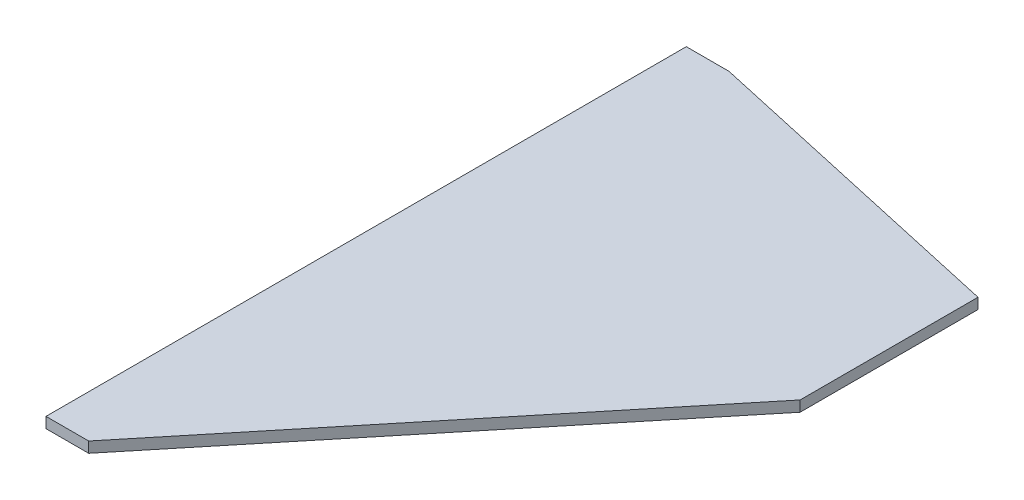
ISO-10303-21;
HEADER;
FILE_DESCRIPTION(('STEP AP214'),'2;1');
FILE_NAME('part.step','',(''),(''),'','','');
FILE_SCHEMA(('AUTOMOTIVE_DESIGN { 1 0 10303 214 1 1 1 1 }'));
ENDSEC;
DATA;
#1=APPLICATION_CONTEXT('core data for automotive mechanical design processes');
#2=APPLICATION_PROTOCOL_DEFINITION('international standard','automotive_design',2000,#1);
#3=PRODUCT_CONTEXT('',#1,'mechanical');
#4=PRODUCT('Part','Part','',(#3));
#5=PRODUCT_RELATED_PRODUCT_CATEGORY('part','',(#4));
#6=PRODUCT_DEFINITION_FORMATION('','',#4);
#7=PRODUCT_DEFINITION_CONTEXT('part definition',#1,'design');
#8=PRODUCT_DEFINITION('design','',#6,#7);
#9=PRODUCT_DEFINITION_SHAPE('','',#8);
#10=(LENGTH_UNIT() NAMED_UNIT(*) SI_UNIT(.MILLI.,.METRE.));
#11=(NAMED_UNIT(*) PLANE_ANGLE_UNIT() SI_UNIT($,.RADIAN.));
#12=(NAMED_UNIT(*) SI_UNIT($,.STERADIAN.) SOLID_ANGLE_UNIT());
#13=UNCERTAINTY_MEASURE_WITH_UNIT(LENGTH_MEASURE(1.E-05),#10,'distance_accuracy_value','');
#14=(GEOMETRIC_REPRESENTATION_CONTEXT(3) GLOBAL_UNCERTAINTY_ASSIGNED_CONTEXT((#13)) GLOBAL_UNIT_ASSIGNED_CONTEXT((#10,
#11,#12)) REPRESENTATION_CONTEXT('',''));
#15=CARTESIAN_POINT('',(0.,0.,0.));
#16=DIRECTION('',(0.,0.,1.));
#17=DIRECTION('',(1.,0.,0.));
#18=AXIS2_PLACEMENT_3D('',#15,#16,#17);
#19=CARTESIAN_POINT('',(0.,3.,0.));
#20=DIRECTION('',(1.,0.,0.));
#21=DIRECTION('',(0.,0.,-1.));
#22=AXIS2_PLACEMENT_3D('',#19,#20,#21);
#23=PLANE('',#22);
#24=DIRECTION('',(0.,0.,1.));
#25=VECTOR('',#24,1.);
#26=CARTESIAN_POINT('',(0.,0.,0.));
#27=LINE('',#26,#25);
#28=CARTESIAN_POINT('',(0.,0.,-180.));
#29=VERTEX_POINT('',#28);
#30=CARTESIAN_POINT('',(0.,0.,0.));
#31=VERTEX_POINT('',#30);
#32=EDGE_CURVE('E128',#29,#31,#27,.T.);
#33=ORIENTED_EDGE('',*,*,#32,.T.);
#34=DIRECTION('',(0.,-1.,0.));
#35=VECTOR('',#34,1.);
#36=CARTESIAN_POINT('',(0.,3.,0.));
#37=LINE('',#36,#35);
#38=CARTESIAN_POINT('',(0.,3.,0.));
#39=VERTEX_POINT('',#38);
#40=EDGE_CURVE('E11',#39,#31,#37,.T.);
#41=ORIENTED_EDGE('',*,*,#40,.F.);
#42=DIRECTION('',(0.,0.,1.));
#43=VECTOR('',#42,1.);
#44=CARTESIAN_POINT('',(0.,3.,0.));
#45=LINE('',#44,#43);
#46=CARTESIAN_POINT('',(0.,3.,-180.));
#47=VERTEX_POINT('',#46);
#48=EDGE_CURVE('E144',#47,#39,#45,.T.);
#49=ORIENTED_EDGE('',*,*,#48,.F.);
#50=DIRECTION('',(0.,-1.,0.));
#51=VECTOR('',#50,1.);
#52=CARTESIAN_POINT('',(0.,3.,-180.));
#53=LINE('',#52,#51);
#54=EDGE_CURVE('E124',#47,#29,#53,.T.);
#55=ORIENTED_EDGE('',*,*,#54,.T.);
#56=EDGE_LOOP('',(#33,#41,#49,#55));
#57=FACE_BOUND('',#56,.T.);
#58=ADVANCED_FACE('F39',(#57),#23,.F.);
#59=CARTESIAN_POINT('',(0.,3.,0.));
#60=DIRECTION('',(0.,0.,-1.));
#61=DIRECTION('',(-1.,0.,0.));
#62=AXIS2_PLACEMENT_3D('',#59,#60,#61);
#63=PLANE('',#62);
#64=DIRECTION('',(1.,0.,0.));
#65=VECTOR('',#64,1.);
#66=CARTESIAN_POINT('',(0.,0.,0.));
#67=LINE('',#66,#65);
#68=CARTESIAN_POINT('',(12.,0.,0.));
#69=VERTEX_POINT('',#68);
#70=EDGE_CURVE('E132',#31,#69,#67,.T.);
#71=ORIENTED_EDGE('',*,*,#70,.T.);
#72=DIRECTION('',(0.,-1.,0.));
#73=VECTOR('',#72,1.);
#74=CARTESIAN_POINT('',(12.,3.,0.));
#75=LINE('',#74,#73);
#76=CARTESIAN_POINT('',(12.,3.,0.));
#77=VERTEX_POINT('',#76);
#78=EDGE_CURVE('E48',#77,#69,#75,.T.);
#79=ORIENTED_EDGE('',*,*,#78,.F.);
#80=DIRECTION('',(1.,0.,0.));
#81=VECTOR('',#80,1.);
#82=CARTESIAN_POINT('',(0.,3.,0.));
#83=LINE('',#82,#81);
#84=EDGE_CURVE('E93',#39,#77,#83,.T.);
#85=ORIENTED_EDGE('',*,*,#84,.F.);
#86=ORIENTED_EDGE('',*,*,#40,.T.);
#87=EDGE_LOOP('',(#71,#79,#85,#86));
#88=FACE_BOUND('',#87,.T.);
#89=ADVANCED_FACE('F172',(#88),#63,.F.);
#90=CARTESIAN_POINT('',(12.,3.,0.));
#91=DIRECTION('',(-0.773957299203321,0.,-0.633237790257263));
#92=DIRECTION('',(-0.633237790257263,0.,0.773957299203321));
#93=AXIS2_PLACEMENT_3D('',#90,#91,#92);
#94=PLANE('',#93);
#95=DIRECTION('',(0.633237790257263,0.,-0.773957299203321));
#96=VECTOR('',#95,1.);
#97=CARTESIAN_POINT('',(12.,0.,0.));
#98=LINE('',#97,#96);
#99=CARTESIAN_POINT('',(102.,0.,-110.));
#100=VERTEX_POINT('',#99);
#101=EDGE_CURVE('E135',#69,#100,#98,.T.);
#102=ORIENTED_EDGE('',*,*,#101,.T.);
#103=DIRECTION('',(0.,-1.,0.));
#104=VECTOR('',#103,1.);
#105=CARTESIAN_POINT('',(102.,3.,-110.));
#106=LINE('',#105,#104);
#107=CARTESIAN_POINT('',(102.,3.,-110.));
#108=VERTEX_POINT('',#107);
#109=EDGE_CURVE('E117',#108,#100,#106,.T.);
#110=ORIENTED_EDGE('',*,*,#109,.F.);
#111=DIRECTION('',(0.633237790257263,0.,-0.773957299203321));
#112=VECTOR('',#111,1.);
#113=CARTESIAN_POINT('',(12.,3.,0.));
#114=LINE('',#113,#112);
#115=EDGE_CURVE('E106',#77,#108,#114,.T.);
#116=ORIENTED_EDGE('',*,*,#115,.F.);
#117=ORIENTED_EDGE('',*,*,#78,.T.);
#118=EDGE_LOOP('',(#102,#110,#116,#117));
#119=FACE_BOUND('',#118,.T.);
#120=ADVANCED_FACE('F154',(#119),#94,.F.);
#121=CARTESIAN_POINT('',(102.,3.,-110.));
#122=DIRECTION('',(-1.,0.,0.));
#123=DIRECTION('',(0.,0.,1.));
#124=AXIS2_PLACEMENT_3D('',#121,#122,#123);
#125=PLANE('',#124);
#126=DIRECTION('',(0.,0.,-1.));
#127=VECTOR('',#126,1.);
#128=CARTESIAN_POINT('',(102.,0.,-110.));
#129=LINE('',#128,#127);
#130=CARTESIAN_POINT('',(102.,0.,-160.));
#131=VERTEX_POINT('',#130);
#132=EDGE_CURVE('E115',#100,#131,#129,.T.);
#133=ORIENTED_EDGE('',*,*,#132,.T.);
#134=DIRECTION('',(0.,-1.,0.));
#135=VECTOR('',#134,1.);
#136=CARTESIAN_POINT('',(102.,3.,-160.));
#137=LINE('',#136,#135);
#138=CARTESIAN_POINT('',(102.,3.,-160.));
#139=VERTEX_POINT('',#138);
#140=EDGE_CURVE('E112',#139,#131,#137,.T.);
#141=ORIENTED_EDGE('',*,*,#140,.F.);
#142=DIRECTION('',(0.,0.,-1.));
#143=VECTOR('',#142,1.);
#144=CARTESIAN_POINT('',(102.,3.,-110.));
#145=LINE('',#144,#143);
#146=EDGE_CURVE('E100',#108,#139,#145,.T.);
#147=ORIENTED_EDGE('',*,*,#146,.F.);
#148=ORIENTED_EDGE('',*,*,#109,.T.);
#149=EDGE_LOOP('',(#133,#141,#147,#148));
#150=FACE_BOUND('',#149,.T.);
#151=ADVANCED_FACE('F113',(#150),#125,.F.);
#152=CARTESIAN_POINT('',(102.,3.,-160.));
#153=DIRECTION('',(-0.216930457818656,0.,0.976187060183953));
#154=DIRECTION('',(0.976187060183953,0.,0.216930457818656));
#155=AXIS2_PLACEMENT_3D('',#152,#153,#154);
#156=PLANE('',#155);
#157=DIRECTION('',(-0.976187060183953,0.,-0.216930457818656));
#158=VECTOR('',#157,1.);
#159=CARTESIAN_POINT('',(102.,0.,-160.));
#160=LINE('',#159,#158);
#161=CARTESIAN_POINT('',(12.,0.,-180.));
#162=VERTEX_POINT('',#161);
#163=EDGE_CURVE('E79',#131,#162,#160,.T.);
#164=ORIENTED_EDGE('',*,*,#163,.T.);
#165=DIRECTION('',(0.,-1.,0.));
#166=VECTOR('',#165,1.);
#167=CARTESIAN_POINT('',(12.,3.,-180.));
#168=LINE('',#167,#166);
#169=CARTESIAN_POINT('',(12.,3.,-180.));
#170=VERTEX_POINT('',#169);
#171=EDGE_CURVE('E118',#170,#162,#168,.T.);
#172=ORIENTED_EDGE('',*,*,#171,.F.);
#173=DIRECTION('',(-0.976187060183953,0.,-0.216930457818656));
#174=VECTOR('',#173,1.);
#175=CARTESIAN_POINT('',(102.,3.,-160.));
#176=LINE('',#175,#174);
#177=EDGE_CURVE('E104',#139,#170,#176,.T.);
#178=ORIENTED_EDGE('',*,*,#177,.F.);
#179=ORIENTED_EDGE('',*,*,#140,.T.);
#180=EDGE_LOOP('',(#164,#172,#178,#179));
#181=FACE_BOUND('',#180,.T.);
#182=ADVANCED_FACE('F120',(#181),#156,.F.);
#183=CARTESIAN_POINT('',(0.,3.,-180.));
#184=DIRECTION('',(0.,0.,1.));
#185=DIRECTION('',(1.,0.,0.));
#186=AXIS2_PLACEMENT_3D('',#183,#184,#185);
#187=PLANE('',#186);
#188=DIRECTION('',(-1.,0.,0.));
#189=VECTOR('',#188,1.);
#190=CARTESIAN_POINT('',(0.,0.,-180.));
#191=LINE('',#190,#189);
#192=EDGE_CURVE('E85',#162,#29,#191,.T.);
#193=ORIENTED_EDGE('',*,*,#192,.T.);
#194=ORIENTED_EDGE('',*,*,#54,.F.);
#195=DIRECTION('',(-1.,0.,0.));
#196=VECTOR('',#195,1.);
#197=CARTESIAN_POINT('',(0.,3.,-180.));
#198=LINE('',#197,#196);
#199=EDGE_CURVE('E56',#170,#47,#198,.T.);
#200=ORIENTED_EDGE('',*,*,#199,.F.);
#201=ORIENTED_EDGE('',*,*,#171,.T.);
#202=EDGE_LOOP('',(#193,#194,#200,#201));
#203=FACE_BOUND('',#202,.T.);
#204=ADVANCED_FACE('F161',(#203),#187,.F.);
#205=CARTESIAN_POINT('',(0.,3.,0.));
#206=DIRECTION('',(0.,-1.,0.));
#207=DIRECTION('',(0.,0.,-1.));
#208=AXIS2_PLACEMENT_3D('',#205,#206,#207);
#209=PLANE('',#208);
#210=ORIENTED_EDGE('',*,*,#48,.T.);
#211=ORIENTED_EDGE('',*,*,#84,.T.);
#212=ORIENTED_EDGE('',*,*,#115,.T.);
#213=ORIENTED_EDGE('',*,*,#146,.T.);
#214=ORIENTED_EDGE('',*,*,#177,.T.);
#215=ORIENTED_EDGE('',*,*,#199,.T.);
#216=EDGE_LOOP('',(#210,#211,#212,#213,#214,#215));
#217=FACE_BOUND('',#216,.T.);
#218=ADVANCED_FACE('F102',(#217),#209,.F.);
#219=CARTESIAN_POINT('',(0.,0.,0.));
#220=DIRECTION('',(0.,-1.,0.));
#221=DIRECTION('',(0.,0.,-1.));
#222=AXIS2_PLACEMENT_3D('',#219,#220,#221);
#223=PLANE('',#222);
#224=ORIENTED_EDGE('',*,*,#32,.F.);
#225=ORIENTED_EDGE('',*,*,#192,.F.);
#226=ORIENTED_EDGE('',*,*,#163,.F.);
#227=ORIENTED_EDGE('',*,*,#132,.F.);
#228=ORIENTED_EDGE('',*,*,#101,.F.);
#229=ORIENTED_EDGE('',*,*,#70,.F.);
#230=EDGE_LOOP('',(#224,#225,#226,#227,#228,#229));
#231=FACE_BOUND('',#230,.T.);
#232=ADVANCED_FACE('F157',(#231),#223,.T.);
#233=CLOSED_SHELL('',(#58,#89,#120,#151,#182,#204,#218,#232));
#234=MANIFOLD_SOLID_BREP('B2',#233);
#235=ADVANCED_BREP_SHAPE_REPRESENTATION('',(#18,#234),#14);
#236=SHAPE_DEFINITION_REPRESENTATION(#9,#235);
ENDSEC;
END-ISO-10303-21;
